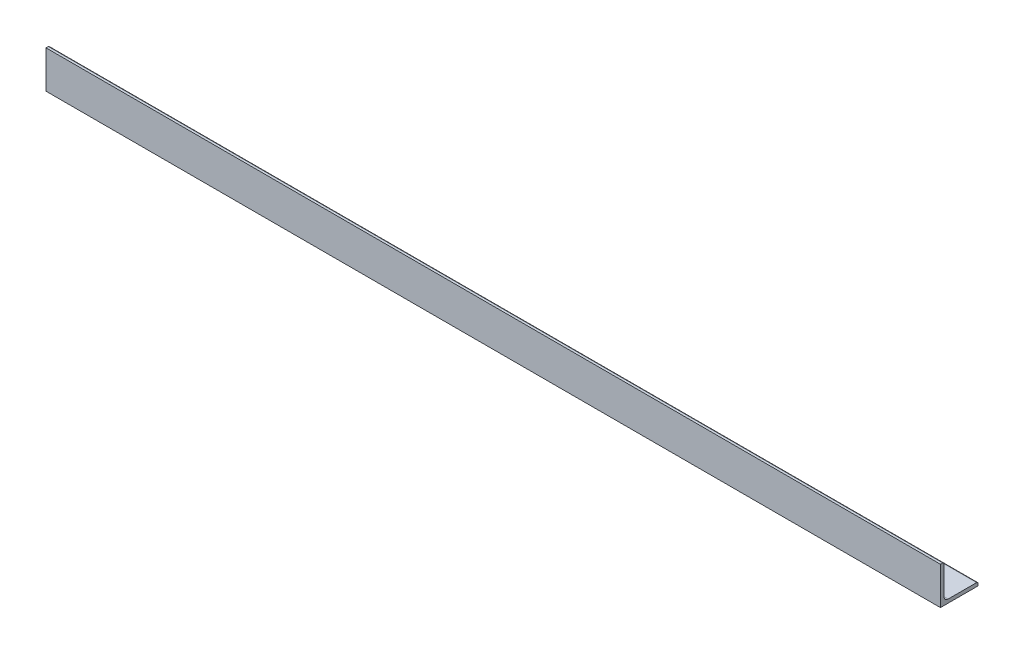
ISO-10303-21;
HEADER;
FILE_DESCRIPTION(('STEP AP214'),'2;1');
FILE_NAME('part.step','',(''),(''),'','','');
FILE_SCHEMA(('AUTOMOTIVE_DESIGN { 1 0 10303 214 1 1 1 1 }'));
ENDSEC;
DATA;
#1=APPLICATION_CONTEXT('core data for automotive mechanical design processes');
#2=APPLICATION_PROTOCOL_DEFINITION('international standard','automotive_design',2000,#1);
#3=PRODUCT_CONTEXT('',#1,'mechanical');
#4=PRODUCT('Part','Part','',(#3));
#5=PRODUCT_RELATED_PRODUCT_CATEGORY('part','',(#4));
#6=PRODUCT_DEFINITION_FORMATION('','',#4);
#7=PRODUCT_DEFINITION_CONTEXT('part definition',#1,'design');
#8=PRODUCT_DEFINITION('design','',#6,#7);
#9=PRODUCT_DEFINITION_SHAPE('','',#8);
#10=(LENGTH_UNIT() NAMED_UNIT(*) SI_UNIT(.MILLI.,.METRE.));
#11=(NAMED_UNIT(*) PLANE_ANGLE_UNIT() SI_UNIT($,.RADIAN.));
#12=(NAMED_UNIT(*) SI_UNIT($,.STERADIAN.) SOLID_ANGLE_UNIT());
#13=UNCERTAINTY_MEASURE_WITH_UNIT(LENGTH_MEASURE(1.E-05),#10,'distance_accuracy_value','');
#14=(GEOMETRIC_REPRESENTATION_CONTEXT(3) GLOBAL_UNCERTAINTY_ASSIGNED_CONTEXT((#13)) GLOBAL_UNIT_ASSIGNED_CONTEXT((#10,
#11,#12)) REPRESENTATION_CONTEXT('',''));
#15=CARTESIAN_POINT('',(0.,0.,0.));
#16=DIRECTION('',(0.,0.,1.));
#17=DIRECTION('',(1.,0.,0.));
#18=AXIS2_PLACEMENT_3D('',#15,#16,#17);
#19=CARTESIAN_POINT('',(-750.,-4.44089209850063E-13,437.));
#20=DIRECTION('',(0.,0.,1.));
#21=DIRECTION('',(0.,-1.,0.));
#22=AXIS2_PLACEMENT_3D('',#19,#20,#21);
#23=PLANE('',#22);
#24=DIRECTION('',(0.,1.,0.));
#25=VECTOR('',#24,1.);
#26=CARTESIAN_POINT('',(750.,-7.46877307475107E-13,437.));
#27=LINE('',#26,#25);
#28=CARTESIAN_POINT('',(750.,-4.44089209850063E-13,437.));
#29=VERTEX_POINT('',#28);
#30=CARTESIAN_POINT('',(750.,3.69999999999959,437.));
#31=VERTEX_POINT('',#30);
#32=EDGE_CURVE('E112',#29,#31,#27,.T.);
#33=ORIENTED_EDGE('',*,*,#32,.F.);
#34=DIRECTION('',(1.,0.,0.));
#35=VECTOR('',#34,1.);
#36=CARTESIAN_POINT('',(-750.,-4.44089209850063E-13,437.));
#37=LINE('',#36,#35);
#38=CARTESIAN_POINT('',(-750.,-4.44089209850063E-13,437.));
#39=VERTEX_POINT('',#38);
#40=EDGE_CURVE('E149',#39,#29,#37,.T.);
#41=ORIENTED_EDGE('',*,*,#40,.F.);
#42=DIRECTION('',(0.,-1.,0.));
#43=VECTOR('',#42,1.);
#44=CARTESIAN_POINT('',(-750.,-4.44089209850063E-13,437.));
#45=LINE('',#44,#43);
#46=CARTESIAN_POINT('',(-750.000000000001,3.69999999999959,437.));
#47=VERTEX_POINT('',#46);
#48=EDGE_CURVE('E103',#47,#39,#45,.T.);
#49=ORIENTED_EDGE('',*,*,#48,.F.);
#50=DIRECTION('',(1.,0.,0.));
#51=VECTOR('',#50,1.);
#52=CARTESIAN_POINT('',(-750.,3.69999999999959,437.));
#53=LINE('',#52,#51);
#54=EDGE_CURVE('E38',#47,#31,#53,.T.);
#55=ORIENTED_EDGE('',*,*,#54,.T.);
#56=EDGE_LOOP('',(#33,#41,#49,#55));
#57=FACE_BOUND('',#56,.T.);
#58=ADVANCED_FACE('F34',(#57),#23,.F.);
#59=CARTESIAN_POINT('',(-750.,-4.44089209850063E-13,437.));
#60=DIRECTION('',(0.,1.,0.));
#61=DIRECTION('',(0.,0.,1.));
#62=AXIS2_PLACEMENT_3D('',#59,#60,#61);
#63=PLANE('',#62);
#64=DIRECTION('',(0.,0.,-1.));
#65=VECTOR('',#64,1.);
#66=CARTESIAN_POINT('',(750.,-4.44089209850061E-13,437.));
#67=LINE('',#66,#65);
#68=CARTESIAN_POINT('',(750.,0.,500.));
#69=VERTEX_POINT('',#68);
#70=EDGE_CURVE('E109',#69,#29,#67,.T.);
#71=ORIENTED_EDGE('',*,*,#70,.F.);
#72=DIRECTION('',(1.,0.,0.));
#73=VECTOR('',#72,1.);
#74=CARTESIAN_POINT('',(-750.,0.,500.));
#75=LINE('',#74,#73);
#76=CARTESIAN_POINT('',(-750.,0.,500.));
#77=VERTEX_POINT('',#76);
#78=EDGE_CURVE('E147',#77,#69,#75,.T.);
#79=ORIENTED_EDGE('',*,*,#78,.F.);
#80=DIRECTION('',(0.,0.,1.));
#81=VECTOR('',#80,1.);
#82=CARTESIAN_POINT('',(-750.,-4.44089209850063E-13,437.));
#83=LINE('',#82,#81);
#84=EDGE_CURVE('E173',#39,#77,#83,.T.);
#85=ORIENTED_EDGE('',*,*,#84,.F.);
#86=ORIENTED_EDGE('',*,*,#40,.T.);
#87=EDGE_LOOP('',(#71,#79,#85,#86));
#88=FACE_BOUND('',#87,.T.);
#89=ADVANCED_FACE('F163',(#88),#63,.F.);
#90=CARTESIAN_POINT('',(-750.,0.,500.));
#91=DIRECTION('',(0.,0.,-1.));
#92=DIRECTION('',(0.,1.,0.));
#93=AXIS2_PLACEMENT_3D('',#90,#91,#92);
#94=PLANE('',#93);
#95=DIRECTION('',(0.,-1.,0.));
#96=VECTOR('',#95,1.);
#97=CARTESIAN_POINT('',(750.,-3.02788097625044E-13,500.));
#98=LINE('',#97,#96);
#99=CARTESIAN_POINT('',(750.,62.9999999999999,500.));
#100=VERTEX_POINT('',#99);
#101=EDGE_CURVE('E11',#100,#69,#98,.T.);
#102=ORIENTED_EDGE('',*,*,#101,.F.);
#103=DIRECTION('',(1.,0.,0.));
#104=VECTOR('',#103,1.);
#105=CARTESIAN_POINT('',(-750.,62.9999999999999,500.));
#106=LINE('',#105,#104);
#107=CARTESIAN_POINT('',(-750.,62.9999999999999,500.));
#108=VERTEX_POINT('',#107);
#109=EDGE_CURVE('E144',#108,#100,#106,.T.);
#110=ORIENTED_EDGE('',*,*,#109,.F.);
#111=DIRECTION('',(0.,1.,0.));
#112=VECTOR('',#111,1.);
#113=CARTESIAN_POINT('',(-750.,0.,500.));
#114=LINE('',#113,#112);
#115=EDGE_CURVE('E170',#77,#108,#114,.T.);
#116=ORIENTED_EDGE('',*,*,#115,.F.);
#117=ORIENTED_EDGE('',*,*,#78,.T.);
#118=EDGE_LOOP('',(#102,#110,#116,#117));
#119=FACE_BOUND('',#118,.T.);
#120=ADVANCED_FACE('F167',(#119),#94,.F.);
#121=CARTESIAN_POINT('',(-750.,62.9999999999999,496.3));
#122=DIRECTION('',(0.,-1.,0.));
#123=DIRECTION('',(0.,0.,-1.));
#124=AXIS2_PLACEMENT_3D('',#121,#122,#123);
#125=PLANE('',#124);
#126=DIRECTION('',(0.,0.,1.));
#127=VECTOR('',#126,1.);
#128=CARTESIAN_POINT('',(750.,62.9999999999999,496.3));
#129=LINE('',#128,#127);
#130=CARTESIAN_POINT('',(750.,62.9999999999999,496.3));
#131=VERTEX_POINT('',#130);
#132=EDGE_CURVE('E43',#131,#100,#129,.T.);
#133=ORIENTED_EDGE('',*,*,#132,.F.);
#134=DIRECTION('',(1.,0.,0.));
#135=VECTOR('',#134,1.);
#136=CARTESIAN_POINT('',(-750.,62.9999999999999,496.3));
#137=LINE('',#136,#135);
#138=CARTESIAN_POINT('',(-750.000000000001,62.9999999999999,496.3));
#139=VERTEX_POINT('',#138);
#140=EDGE_CURVE('E141',#139,#131,#137,.T.);
#141=ORIENTED_EDGE('',*,*,#140,.F.);
#142=DIRECTION('',(0.,0.,-1.));
#143=VECTOR('',#142,1.);
#144=CARTESIAN_POINT('',(-750.,62.9999999999999,496.3));
#145=LINE('',#144,#143);
#146=EDGE_CURVE('E172',#108,#139,#145,.T.);
#147=ORIENTED_EDGE('',*,*,#146,.F.);
#148=ORIENTED_EDGE('',*,*,#109,.T.);
#149=EDGE_LOOP('',(#133,#141,#147,#148));
#150=FACE_BOUND('',#149,.T.);
#151=ADVANCED_FACE('F214',(#150),#125,.F.);
#152=CARTESIAN_POINT('',(-750.,60.7,496.3));
#153=DIRECTION('',(1.,0.,0.));
#154=DIRECTION('',(0.,0.,-1.));
#155=AXIS2_PLACEMENT_3D('',#152,#153,#154);
#156=CYLINDRICAL_SURFACE('',#155,2.29999999999997);
#157=CARTESIAN_POINT('',(750.,60.7,496.3));
#158=DIRECTION('',(1.,0.,0.));
#159=DIRECTION('',(0.,1.,0.));
#160=AXIS2_PLACEMENT_3D('',#157,#158,#159);
#161=CIRCLE('',#160,2.29999999999997);
#162=CARTESIAN_POINT('',(750.,60.7,494.));
#163=VERTEX_POINT('',#162);
#164=EDGE_CURVE('E123',#163,#131,#161,.T.);
#165=ORIENTED_EDGE('',*,*,#164,.F.);
#166=DIRECTION('',(1.,0.,0.));
#167=VECTOR('',#166,1.);
#168=CARTESIAN_POINT('',(-750.,60.7,494.));
#169=LINE('',#168,#167);
#170=CARTESIAN_POINT('',(-750.,60.7,494.));
#171=VERTEX_POINT('',#170);
#172=EDGE_CURVE('E138',#171,#163,#169,.T.);
#173=ORIENTED_EDGE('',*,*,#172,.F.);
#174=CARTESIAN_POINT('',(-750.000000000001,60.7,496.3));
#175=DIRECTION('',(-1.,0.,0.));
#176=DIRECTION('',(0.,-1.,0.));
#177=AXIS2_PLACEMENT_3D('',#174,#175,#176);
#178=CIRCLE('',#177,2.29999999999997);
#179=EDGE_CURVE('E175',#139,#171,#178,.T.);
#180=ORIENTED_EDGE('',*,*,#179,.F.);
#181=ORIENTED_EDGE('',*,*,#140,.T.);
#182=EDGE_LOOP('',(#165,#173,#180,#181));
#183=FACE_BOUND('',#182,.T.);
#184=ADVANCED_FACE('F188',(#183),#156,.T.);
#185=CARTESIAN_POINT('',(-750.,12.9999999999999,494.));
#186=DIRECTION('',(0.,0.,1.));
#187=DIRECTION('',(0.,-1.,0.));
#188=AXIS2_PLACEMENT_3D('',#185,#186,#187);
#189=PLANE('',#188);
#190=DIRECTION('',(0.,1.,0.));
#191=VECTOR('',#190,1.);
#192=CARTESIAN_POINT('',(750.,12.9999999999996,494.));
#193=LINE('',#192,#191);
#194=CARTESIAN_POINT('',(750.,12.9999999999999,494.));
#195=VERTEX_POINT('',#194);
#196=EDGE_CURVE('E126',#195,#163,#193,.T.);
#197=ORIENTED_EDGE('',*,*,#196,.F.);
#198=DIRECTION('',(1.,0.,0.));
#199=VECTOR('',#198,1.);
#200=CARTESIAN_POINT('',(-750.,12.9999999999999,494.));
#201=LINE('',#200,#199);
#202=CARTESIAN_POINT('',(-750.000000000001,12.9999999999999,494.));
#203=VERTEX_POINT('',#202);
#204=EDGE_CURVE('E135',#203,#195,#201,.T.);
#205=ORIENTED_EDGE('',*,*,#204,.F.);
#206=DIRECTION('',(0.,-1.,0.));
#207=VECTOR('',#206,1.);
#208=CARTESIAN_POINT('',(-750.,12.9999999999999,494.));
#209=LINE('',#208,#207);
#210=EDGE_CURVE('E114',#171,#203,#209,.T.);
#211=ORIENTED_EDGE('',*,*,#210,.F.);
#212=ORIENTED_EDGE('',*,*,#172,.T.);
#213=EDGE_LOOP('',(#197,#205,#211,#212));
#214=FACE_BOUND('',#213,.T.);
#215=ADVANCED_FACE('F185',(#214),#189,.F.);
#216=CARTESIAN_POINT('',(-750.,12.9999999999999,487.));
#217=DIRECTION('',(1.,0.,0.));
#218=DIRECTION('',(0.,0.,-1.));
#219=AXIS2_PLACEMENT_3D('',#216,#217,#218);
#220=CYLINDRICAL_SURFACE('',#219,7.00000000000001);
#221=CARTESIAN_POINT('',(750.,12.9999999999999,487.));
#222=DIRECTION('',(1.,0.,0.));
#223=DIRECTION('',(0.,1.,0.));
#224=AXIS2_PLACEMENT_3D('',#221,#222,#223);
#225=CIRCLE('',#224,7.00000000000001);
#226=CARTESIAN_POINT('',(750.,5.99999999999989,487.));
#227=VERTEX_POINT('',#226);
#228=EDGE_CURVE('E129',#227,#195,#225,.F.);
#229=ORIENTED_EDGE('',*,*,#228,.F.);
#230=DIRECTION('',(1.,0.,0.));
#231=VECTOR('',#230,1.);
#232=CARTESIAN_POINT('',(-750.,5.99999999999989,487.));
#233=LINE('',#232,#231);
#234=CARTESIAN_POINT('',(-750.,5.99999999999989,487.));
#235=VERTEX_POINT('',#234);
#236=EDGE_CURVE('E97',#235,#227,#233,.T.);
#237=ORIENTED_EDGE('',*,*,#236,.F.);
#238=CARTESIAN_POINT('',(-750.000000000001,12.9999999999999,487.));
#239=DIRECTION('',(-1.,0.,0.));
#240=DIRECTION('',(0.,-1.,0.));
#241=AXIS2_PLACEMENT_3D('',#238,#239,#240);
#242=CIRCLE('',#241,7.00000000000001);
#243=EDGE_CURVE('E108',#203,#235,#242,.F.);
#244=ORIENTED_EDGE('',*,*,#243,.F.);
#245=ORIENTED_EDGE('',*,*,#204,.T.);
#246=EDGE_LOOP('',(#229,#237,#244,#245));
#247=FACE_BOUND('',#246,.T.);
#248=ADVANCED_FACE('F197',(#247),#220,.F.);
#249=CARTESIAN_POINT('',(-750.,5.99999999999956,439.3));
#250=DIRECTION('',(0.,-1.,0.));
#251=DIRECTION('',(0.,0.,-1.));
#252=AXIS2_PLACEMENT_3D('',#249,#250,#251);
#253=PLANE('',#252);
#254=DIRECTION('',(0.,0.,1.));
#255=VECTOR('',#254,1.);
#256=CARTESIAN_POINT('',(750.,5.99999999999956,439.3));
#257=LINE('',#256,#255);
#258=CARTESIAN_POINT('',(750.,5.99999999999959,439.3));
#259=VERTEX_POINT('',#258);
#260=EDGE_CURVE('E94',#259,#227,#257,.T.);
#261=ORIENTED_EDGE('',*,*,#260,.F.);
#262=DIRECTION('',(1.,0.,0.));
#263=VECTOR('',#262,1.);
#264=CARTESIAN_POINT('',(-750.,5.99999999999956,439.3));
#265=LINE('',#264,#263);
#266=CARTESIAN_POINT('',(-750.000000000001,5.99999999999956,439.3));
#267=VERTEX_POINT('',#266);
#268=EDGE_CURVE('E51',#267,#259,#265,.T.);
#269=ORIENTED_EDGE('',*,*,#268,.F.);
#270=DIRECTION('',(0.,0.,-1.));
#271=VECTOR('',#270,1.);
#272=CARTESIAN_POINT('',(-750.,5.99999999999956,439.3));
#273=LINE('',#272,#271);
#274=EDGE_CURVE('E91',#235,#267,#273,.T.);
#275=ORIENTED_EDGE('',*,*,#274,.F.);
#276=ORIENTED_EDGE('',*,*,#236,.T.);
#277=EDGE_LOOP('',(#261,#269,#275,#276));
#278=FACE_BOUND('',#277,.T.);
#279=ADVANCED_FACE('F88',(#278),#253,.F.);
#280=CARTESIAN_POINT('',(-750.,3.69999999999959,439.3));
#281=DIRECTION('',(1.,0.,0.));
#282=DIRECTION('',(0.,0.,-1.));
#283=AXIS2_PLACEMENT_3D('',#280,#281,#282);
#284=CYLINDRICAL_SURFACE('',#283,2.3);
#285=CARTESIAN_POINT('',(750.,3.69999999999959,439.3));
#286=DIRECTION('',(1.,0.,0.));
#287=DIRECTION('',(0.,1.,0.));
#288=AXIS2_PLACEMENT_3D('',#285,#286,#287);
#289=CIRCLE('',#288,2.3);
#290=EDGE_CURVE('E119',#31,#259,#289,.T.);
#291=ORIENTED_EDGE('',*,*,#290,.F.);
#292=ORIENTED_EDGE('',*,*,#54,.F.);
#293=CARTESIAN_POINT('',(-750.000000000001,3.69999999999959,439.3));
#294=DIRECTION('',(-1.,0.,0.));
#295=DIRECTION('',(0.,-1.,0.));
#296=AXIS2_PLACEMENT_3D('',#293,#294,#295);
#297=CIRCLE('',#296,2.3);
#298=EDGE_CURVE('E96',#267,#47,#297,.T.);
#299=ORIENTED_EDGE('',*,*,#298,.F.);
#300=ORIENTED_EDGE('',*,*,#268,.T.);
#301=EDGE_LOOP('',(#291,#292,#299,#300));
#302=FACE_BOUND('',#301,.T.);
#303=ADVANCED_FACE('F100',(#302),#284,.T.);
#304=CARTESIAN_POINT('',(-750.000000000001,0.,437.));
#305=DIRECTION('',(-1.,0.,0.));
#306=DIRECTION('',(0.,-1.,0.));
#307=AXIS2_PLACEMENT_3D('',#304,#305,#306);
#308=PLANE('',#307);
#309=ORIENTED_EDGE('',*,*,#298,.T.);
#310=ORIENTED_EDGE('',*,*,#48,.T.);
#311=ORIENTED_EDGE('',*,*,#84,.T.);
#312=ORIENTED_EDGE('',*,*,#115,.T.);
#313=ORIENTED_EDGE('',*,*,#146,.T.);
#314=ORIENTED_EDGE('',*,*,#179,.T.);
#315=ORIENTED_EDGE('',*,*,#210,.T.);
#316=ORIENTED_EDGE('',*,*,#243,.T.);
#317=ORIENTED_EDGE('',*,*,#274,.T.);
#318=EDGE_LOOP('',(#309,#310,#311,#312,#313,#314,#315,#316,#317));
#319=FACE_BOUND('',#318,.T.);
#320=ADVANCED_FACE('F106',(#319),#308,.T.);
#321=CARTESIAN_POINT('',(750.,0.,500.));
#322=DIRECTION('',(1.,0.,0.));
#323=DIRECTION('',(0.,1.,0.));
#324=AXIS2_PLACEMENT_3D('',#321,#322,#323);
#325=PLANE('',#324);
#326=ORIENTED_EDGE('',*,*,#70,.T.);
#327=ORIENTED_EDGE('',*,*,#32,.T.);
#328=ORIENTED_EDGE('',*,*,#290,.T.);
#329=ORIENTED_EDGE('',*,*,#260,.T.);
#330=ORIENTED_EDGE('',*,*,#228,.T.);
#331=ORIENTED_EDGE('',*,*,#196,.T.);
#332=ORIENTED_EDGE('',*,*,#164,.T.);
#333=ORIENTED_EDGE('',*,*,#132,.T.);
#334=ORIENTED_EDGE('',*,*,#101,.T.);
#335=EDGE_LOOP('',(#326,#327,#328,#329,#330,#331,#332,#333,#334));
#336=FACE_BOUND('',#335,.T.);
#337=ADVANCED_FACE('F36',(#336),#325,.T.);
#338=CLOSED_SHELL('',(#58,#89,#120,#151,#184,#215,#248,#279,#303,#320,#337));
#339=MANIFOLD_SOLID_BREP('B2',#338);
#340=ADVANCED_BREP_SHAPE_REPRESENTATION('',(#18,#339),#14);
#341=SHAPE_DEFINITION_REPRESENTATION(#9,#340);
ENDSEC;
END-ISO-10303-21;
